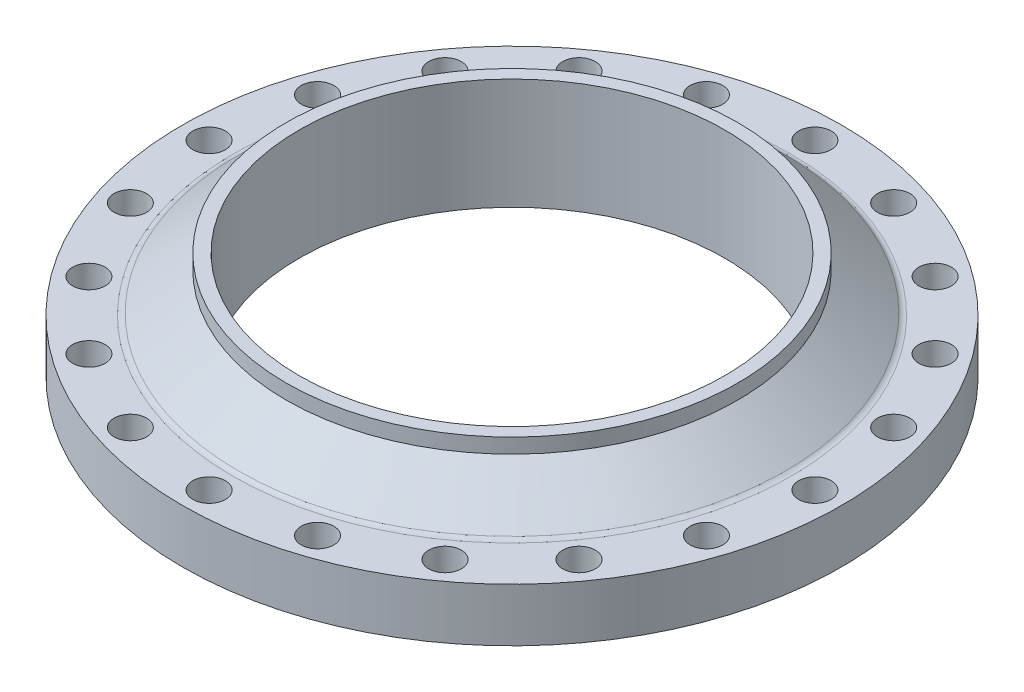
ISO-10303-21;
HEADER;
FILE_DESCRIPTION(('STEP AP214'),'2;1');
FILE_NAME('part.step','',(''),(''),'','','');
FILE_SCHEMA(('AUTOMOTIVE_DESIGN { 1 0 10303 214 1 1 1 1 }'));
ENDSEC;
DATA;
#1=APPLICATION_CONTEXT('core data for automotive mechanical design processes');
#2=APPLICATION_PROTOCOL_DEFINITION('international standard','automotive_design',2000,#1);
#3=PRODUCT_CONTEXT('',#1,'mechanical');
#4=PRODUCT('Part','Part','',(#3));
#5=PRODUCT_RELATED_PRODUCT_CATEGORY('part','',(#4));
#6=PRODUCT_DEFINITION_FORMATION('','',#4);
#7=PRODUCT_DEFINITION_CONTEXT('part definition',#1,'design');
#8=PRODUCT_DEFINITION('design','',#6,#7);
#9=PRODUCT_DEFINITION_SHAPE('','',#8);
#10=(LENGTH_UNIT() NAMED_UNIT(*) SI_UNIT(.MILLI.,.METRE.));
#11=(NAMED_UNIT(*) PLANE_ANGLE_UNIT() SI_UNIT($,.RADIAN.));
#12=(NAMED_UNIT(*) SI_UNIT($,.STERADIAN.) SOLID_ANGLE_UNIT());
#13=UNCERTAINTY_MEASURE_WITH_UNIT(LENGTH_MEASURE(1.E-05),#10,'distance_accuracy_value','');
#14=(GEOMETRIC_REPRESENTATION_CONTEXT(3) GLOBAL_UNCERTAINTY_ASSIGNED_CONTEXT((#13)) GLOBAL_UNIT_ASSIGNED_CONTEXT((#10,
#11,#12)) REPRESENTATION_CONTEXT('',''));
#15=CARTESIAN_POINT('',(0.,0.,0.));
#16=DIRECTION('',(0.,0.,1.));
#17=DIRECTION('',(1.,0.,0.));
#18=AXIS2_PLACEMENT_3D('',#15,#16,#17);
#19=CARTESIAN_POINT('',(287.4,150.,0.));
#20=DIRECTION('',(0.,-1.,0.));
#21=DIRECTION('',(0.,0.,-1.));
#22=AXIS2_PLACEMENT_3D('',#19,#20,#21);
#23=PLANE('',#22);
#24=CARTESIAN_POINT('',(0.,150.,0.));
#25=DIRECTION('',(0.,1.,0.));
#26=DIRECTION('',(0.,0.,1.));
#27=AXIS2_PLACEMENT_3D('',#24,#25,#26);
#28=CIRCLE('',#27,287.4);
#29=CARTESIAN_POINT('',(0.,150.,287.4));
#30=VERTEX_POINT('',#29);
#31=EDGE_CURVE('E10',#30,#30,#28,.T.);
#32=ORIENTED_EDGE('',*,*,#31,.F.);
#33=EDGE_LOOP('',(#32));
#34=FACE_BOUND('',#33,.T.);
#35=CARTESIAN_POINT('',(0.,150.,0.));
#36=DIRECTION('',(0.,1.,0.));
#37=DIRECTION('',(0.,0.,1.));
#38=AXIS2_PLACEMENT_3D('',#35,#36,#37);
#39=CIRCLE('',#38,304.8);
#40=CARTESIAN_POINT('',(0.,150.,304.8));
#41=VERTEX_POINT('',#40);
#42=EDGE_CURVE('E65',#41,#41,#39,.T.);
#43=ORIENTED_EDGE('',*,*,#42,.T.);
#44=EDGE_LOOP('',(#43));
#45=FACE_BOUND('',#44,.T.);
#46=ADVANCED_FACE('F31',(#34,#45),#23,.F.);
#47=CARTESIAN_POINT('',(0.,163.859738805859,0.));
#48=DIRECTION('',(0.,1.,0.));
#49=DIRECTION('',(0.,0.,1.));
#50=AXIS2_PLACEMENT_3D('',#47,#48,#49);
#51=CYLINDRICAL_SURFACE('',#50,287.4);
#52=CARTESIAN_POINT('',(0.,0.,0.));
#53=DIRECTION('',(0.,1.,0.));
#54=DIRECTION('',(0.,0.,1.));
#55=AXIS2_PLACEMENT_3D('',#52,#53,#54);
#56=CIRCLE('',#55,287.4);
#57=CARTESIAN_POINT('',(0.,0.,287.4));
#58=VERTEX_POINT('',#57);
#59=EDGE_CURVE('E37',#58,#58,#56,.T.);
#60=ORIENTED_EDGE('',*,*,#59,.F.);
#61=EDGE_LOOP('',(#60));
#62=FACE_BOUND('',#61,.T.);
#63=ORIENTED_EDGE('',*,*,#31,.T.);
#64=EDGE_LOOP('',(#63));
#65=FACE_BOUND('',#64,.T.);
#66=ADVANCED_FACE('F216',(#62,#65),#51,.F.);
#67=CARTESIAN_POINT('',(370.,0.,0.));
#68=DIRECTION('',(0.,1.,0.));
#69=DIRECTION('',(0.,0.,1.));
#70=AXIS2_PLACEMENT_3D('',#67,#68,#69);
#71=PLANE('',#70);
#72=CARTESIAN_POINT('',(0.,0.,0.));
#73=DIRECTION('',(0.,1.,0.));
#74=DIRECTION('',(0.,0.,1.));
#75=AXIS2_PLACEMENT_3D('',#72,#73,#74);
#76=CIRCLE('',#75,370.);
#77=CARTESIAN_POINT('',(0.,0.,370.));
#78=VERTEX_POINT('',#77);
#79=EDGE_CURVE('E41',#78,#78,#76,.T.);
#80=ORIENTED_EDGE('',*,*,#79,.F.);
#81=EDGE_LOOP('',(#80));
#82=FACE_BOUND('',#81,.T.);
#83=ORIENTED_EDGE('',*,*,#59,.T.);
#84=EDGE_LOOP('',(#83));
#85=FACE_BOUND('',#84,.T.);
#86=ADVANCED_FACE('F211',(#82,#85),#71,.F.);
#87=CARTESIAN_POINT('',(0.,0.,0.));
#88=DIRECTION('',(0.,1.,0.));
#89=DIRECTION('',(0.,0.,1.));
#90=AXIS2_PLACEMENT_3D('',#87,#88,#89);
#91=CONICAL_SURFACE('',#90,370.,0.785398163397448);
#92=CARTESIAN_POINT('',(0.,5.,0.));
#93=DIRECTION('',(0.,1.,0.));
#94=DIRECTION('',(0.,0.,1.));
#95=AXIS2_PLACEMENT_3D('',#92,#93,#94);
#96=CIRCLE('',#95,375.);
#97=CARTESIAN_POINT('',(0.,5.,375.));
#98=VERTEX_POINT('',#97);
#99=EDGE_CURVE('E45',#98,#98,#96,.T.);
#100=ORIENTED_EDGE('',*,*,#99,.F.);
#101=EDGE_LOOP('',(#100));
#102=FACE_BOUND('',#101,.T.);
#103=ORIENTED_EDGE('',*,*,#79,.T.);
#104=EDGE_LOOP('',(#103));
#105=FACE_BOUND('',#104,.T.);
#106=ADVANCED_FACE('F196',(#102,#105),#91,.T.);
#107=CARTESIAN_POINT('',(445.,5.00000000000002,0.));
#108=DIRECTION('',(0.,1.,0.));
#109=DIRECTION('',(0.,0.,1.));
#110=AXIS2_PLACEMENT_3D('',#107,#108,#109);
#111=PLANE('',#110);
#112=CARTESIAN_POINT('',(-388.982115164706,5.00000000000002,126.387950699337));
#113=DIRECTION('',(0.,-1.,0.));
#114=DIRECTION('',(0.,0.,-1.));
#115=AXIS2_PLACEMENT_3D('',#112,#113,#114);
#116=CIRCLE('',#115,22.0000000000208);
#117=CARTESIAN_POINT('',(-388.982115164706,5.00000000000002,104.387950699316));
#118=VERTEX_POINT('',#117);
#119=EDGE_CURVE('E127',#118,#118,#116,.T.);
#120=ORIENTED_EDGE('',*,*,#119,.F.);
#121=EDGE_LOOP('',(#120));
#122=FACE_BOUND('',#121,.T.);
#123=CARTESIAN_POINT('',(-408.999999999983,5.00000000000002,-1.74116747085103E-11));
#124=DIRECTION('',(0.,-1.,0.));
#125=DIRECTION('',(0.,0.,-1.));
#126=AXIS2_PLACEMENT_3D('',#123,#124,#125);
#127=CIRCLE('',#126,22.0000000000258);
#128=CARTESIAN_POINT('',(-408.999999999983,5.00000000000002,-22.0000000000432));
#129=VERTEX_POINT('',#128);
#130=EDGE_CURVE('E126',#129,#129,#127,.T.);
#131=ORIENTED_EDGE('',*,*,#130,.F.);
#132=EDGE_LOOP('',(#131));
#133=FACE_BOUND('',#132,.T.);
#134=CARTESIAN_POINT('',(-388.982115164695,5.00000000000002,-126.38795069937));
#135=DIRECTION('',(0.,-1.,0.));
#136=DIRECTION('',(0.,0.,-1.));
#137=AXIS2_PLACEMENT_3D('',#134,#135,#136);
#138=CIRCLE('',#137,22.0000000000304);
#139=CARTESIAN_POINT('',(-388.982115164695,5.00000000000002,-148.3879506994));
#140=VERTEX_POINT('',#139);
#141=EDGE_CURVE('E134',#140,#140,#138,.T.);
#142=ORIENTED_EDGE('',*,*,#141,.F.);
#143=EDGE_LOOP('',(#142));
#144=FACE_BOUND('',#143,.T.);
#145=CARTESIAN_POINT('',(-330.887950699326,5.00000000000002,-240.404168187636));
#146=DIRECTION('',(0.,-1.,0.));
#147=DIRECTION('',(0.,0.,-1.));
#148=AXIS2_PLACEMENT_3D('',#145,#146,#147);
#149=CIRCLE('',#148,22.0000000000343);
#150=CARTESIAN_POINT('',(-330.887950699326,5.00000000000002,-262.40416818767));
#151=VERTEX_POINT('',#150);
#152=EDGE_CURVE('E140',#151,#151,#149,.T.);
#153=ORIENTED_EDGE('',*,*,#152,.F.);
#154=EDGE_LOOP('',(#153));
#155=FACE_BOUND('',#154,.T.);
#156=CARTESIAN_POINT('',(-240.40416818759,5.00000000000002,-330.887950699364));
#157=DIRECTION('',(0.,-1.,0.));
#158=DIRECTION('',(0.,0.,-1.));
#159=AXIS2_PLACEMENT_3D('',#156,#157,#158);
#160=CIRCLE('',#159,22.0000000000364);
#161=CARTESIAN_POINT('',(-240.40416818759,5.00000000000002,-352.8879506994));
#162=VERTEX_POINT('',#161);
#163=EDGE_CURVE('E146',#162,#162,#160,.T.);
#164=ORIENTED_EDGE('',*,*,#163,.F.);
#165=EDGE_LOOP('',(#164));
#166=FACE_BOUND('',#165,.T.);
#167=CARTESIAN_POINT('',(-126.38795069932,5.00000000000002,-388.982115164723));
#168=DIRECTION('',(0.,-1.,0.));
#169=DIRECTION('',(0.,0.,-1.));
#170=AXIS2_PLACEMENT_3D('',#167,#168,#169);
#171=CIRCLE('',#170,22.000000000037);
#172=CARTESIAN_POINT('',(-126.38795069932,5.00000000000002,-410.98211516476));
#173=VERTEX_POINT('',#172);
#174=EDGE_CURVE('E152',#173,#173,#171,.T.);
#175=ORIENTED_EDGE('',*,*,#174,.F.);
#176=EDGE_LOOP('',(#175));
#177=FACE_BOUND('',#176,.T.);
#178=CARTESIAN_POINT('',(3.47231733088503E-11,5.00000000000002,-409.));
#179=DIRECTION('',(0.,-1.,0.));
#180=DIRECTION('',(0.,0.,-1.));
#181=AXIS2_PLACEMENT_3D('',#178,#179,#180);
#182=CIRCLE('',#181,22.0000000000359);
#183=CARTESIAN_POINT('',(3.47231733088503E-11,5.00000000000002,-431.000000000036));
#184=VERTEX_POINT('',#183);
#185=EDGE_CURVE('E158',#184,#184,#182,.T.);
#186=ORIENTED_EDGE('',*,*,#185,.F.);
#187=EDGE_LOOP('',(#186));
#188=FACE_BOUND('',#187,.T.);
#189=CARTESIAN_POINT('',(126.387950699387,5.00000000000002,-388.982115164712));
#190=DIRECTION('',(0.,-1.,0.));
#191=DIRECTION('',(0.,0.,-1.));
#192=AXIS2_PLACEMENT_3D('',#189,#190,#191);
#193=CIRCLE('',#192,22.0000000000334);
#194=CARTESIAN_POINT('',(126.387950699387,5.00000000000002,-410.982115164746));
#195=VERTEX_POINT('',#194);
#196=EDGE_CURVE('E164',#195,#195,#193,.T.);
#197=ORIENTED_EDGE('',*,*,#196,.F.);
#198=EDGE_LOOP('',(#197));
#199=FACE_BOUND('',#198,.T.);
#200=CARTESIAN_POINT('',(240.404168187653,5.00000000000002,-330.887950699343));
#201=DIRECTION('',(0.,-1.,0.));
#202=DIRECTION('',(0.,0.,-1.));
#203=AXIS2_PLACEMENT_3D('',#200,#201,#202);
#204=CIRCLE('',#203,22.0000000000293);
#205=CARTESIAN_POINT('',(240.404168187653,5.00000000000002,-352.887950699373));
#206=VERTEX_POINT('',#205);
#207=EDGE_CURVE('E79',#206,#206,#204,.T.);
#208=ORIENTED_EDGE('',*,*,#207,.F.);
#209=EDGE_LOOP('',(#208));
#210=FACE_BOUND('',#209,.T.);
#211=CARTESIAN_POINT('',(330.887950699381,5.00000000000002,-240.404168187607));
#212=DIRECTION('',(0.,-1.,0.));
#213=DIRECTION('',(0.,0.,-1.));
#214=AXIS2_PLACEMENT_3D('',#211,#212,#213);
#215=CIRCLE('',#214,22.0000000000241);
#216=CARTESIAN_POINT('',(330.887950699381,5.00000000000002,-262.404168187632));
#217=VERTEX_POINT('',#216);
#218=EDGE_CURVE('E78',#217,#217,#215,.T.);
#219=ORIENTED_EDGE('',*,*,#218,.F.);
#220=EDGE_LOOP('',(#219));
#221=FACE_BOUND('',#220,.T.);
#222=CARTESIAN_POINT('',(388.98211516474,5.00000000000002,-126.387950699337));
#223=DIRECTION('',(0.,-1.,0.));
#224=DIRECTION('',(0.,0.,-1.));
#225=AXIS2_PLACEMENT_3D('',#222,#223,#224);
#226=CIRCLE('',#225,22.0000000000186);
#227=CARTESIAN_POINT('',(388.98211516474,5.00000000000002,-148.387950699356));
#228=VERTEX_POINT('',#227);
#229=EDGE_CURVE('E86',#228,#228,#226,.T.);
#230=ORIENTED_EDGE('',*,*,#229,.F.);
#231=EDGE_LOOP('',(#230));
#232=FACE_BOUND('',#231,.T.);
#233=CARTESIAN_POINT('',(409.000000000017,5.00000000000002,1.73615866544252E-11));
#234=DIRECTION('',(0.,-1.,0.));
#235=DIRECTION('',(0.,0.,-1.));
#236=AXIS2_PLACEMENT_3D('',#233,#234,#235);
#237=CIRCLE('',#236,22.0000000000129);
#238=CARTESIAN_POINT('',(409.000000000017,5.00000000000002,-21.9999999999955));
#239=VERTEX_POINT('',#238);
#240=EDGE_CURVE('E92',#239,#239,#237,.T.);
#241=ORIENTED_EDGE('',*,*,#240,.F.);
#242=EDGE_LOOP('',(#241));
#243=FACE_BOUND('',#242,.T.);
#244=CARTESIAN_POINT('',(388.98211516473,5.00000000000002,126.38795069937));
#245=DIRECTION('',(0.,-1.,0.));
#246=DIRECTION('',(0.,0.,-1.));
#247=AXIS2_PLACEMENT_3D('',#244,#245,#246);
#248=CIRCLE('',#247,22.0000000000078);
#249=CARTESIAN_POINT('',(388.98211516473,5.00000000000002,104.387950699362));
#250=VERTEX_POINT('',#249);
#251=EDGE_CURVE('E98',#250,#250,#248,.T.);
#252=ORIENTED_EDGE('',*,*,#251,.F.);
#253=EDGE_LOOP('',(#252));
#254=FACE_BOUND('',#253,.T.);
#255=CARTESIAN_POINT('',(330.887950699361,5.00000000000002,240.404168187636));
#256=DIRECTION('',(0.,-1.,0.));
#257=DIRECTION('',(0.,0.,-1.));
#258=AXIS2_PLACEMENT_3D('',#255,#256,#257);
#259=CIRCLE('',#258,22.0000000000035);
#260=CARTESIAN_POINT('',(330.887950699361,5.00000000000002,218.404168187632));
#261=VERTEX_POINT('',#260);
#262=EDGE_CURVE('E104',#261,#261,#259,.T.);
#263=ORIENTED_EDGE('',*,*,#262,.F.);
#264=EDGE_LOOP('',(#263));
#265=FACE_BOUND('',#264,.T.);
#266=CARTESIAN_POINT('',(240.404168187625,5.00000000000002,330.887950699364));
#267=DIRECTION('',(0.,-1.,0.));
#268=DIRECTION('',(0.,0.,-1.));
#269=AXIS2_PLACEMENT_3D('',#266,#267,#268);
#270=CIRCLE('',#269,22.0000000000008);
#271=CARTESIAN_POINT('',(240.404168187625,5.00000000000002,308.887950699363));
#272=VERTEX_POINT('',#271);
#273=EDGE_CURVE('E110',#272,#272,#270,.T.);
#274=ORIENTED_EDGE('',*,*,#273,.F.);
#275=EDGE_LOOP('',(#274));
#276=FACE_BOUND('',#275,.T.);
#277=CARTESIAN_POINT('',(126.387950699354,5.00000000000002,388.982115164718));
#278=DIRECTION('',(0.,-1.,0.));
#279=DIRECTION('',(0.,0.,-1.));
#280=AXIS2_PLACEMENT_3D('',#277,#278,#279);
#281=CIRCLE('',#280,22.);
#282=CARTESIAN_POINT('',(126.387950699354,5.00000000000002,366.982115164718));
#283=VERTEX_POINT('',#282);
#284=EDGE_CURVE('E116',#283,#283,#281,.T.);
#285=ORIENTED_EDGE('',*,*,#284,.F.);
#286=EDGE_LOOP('',(#285));
#287=FACE_BOUND('',#286,.T.);
#288=CARTESIAN_POINT('',(-330.887950699346,5.00000000000002,240.404168187607));
#289=DIRECTION('',(0.,-1.,0.));
#290=DIRECTION('',(0.,0.,-1.));
#291=AXIS2_PLACEMENT_3D('',#288,#289,#290);
#292=CIRCLE('',#291,22.0000000000158);
#293=CARTESIAN_POINT('',(-330.887950699346,5.00000000000002,218.404168187592));
#294=VERTEX_POINT('',#293);
#295=EDGE_CURVE('E181',#294,#294,#292,.T.);
#296=ORIENTED_EDGE('',*,*,#295,.F.);
#297=EDGE_LOOP('',(#296));
#298=FACE_BOUND('',#297,.T.);
#299=CARTESIAN_POINT('',(-240.404168187618,5.00000000000002,330.887950699343));
#300=DIRECTION('',(0.,-1.,0.));
#301=DIRECTION('',(0.,0.,-1.));
#302=AXIS2_PLACEMENT_3D('',#299,#300,#301);
#303=CIRCLE('',#302,22.0000000000113);
#304=CARTESIAN_POINT('',(-240.404168187618,5.00000000000002,308.887950699332));
#305=VERTEX_POINT('',#304);
#306=EDGE_CURVE('E174',#305,#305,#303,.T.);
#307=ORIENTED_EDGE('',*,*,#306,.F.);
#308=EDGE_LOOP('',(#307));
#309=FACE_BOUND('',#308,.T.);
#310=CARTESIAN_POINT('',(-126.387950699348,5.00000000000002,388.982115164719));
#311=DIRECTION('',(0.,-1.,0.));
#312=DIRECTION('',(0.,0.,-1.));
#313=AXIS2_PLACEMENT_3D('',#310,#311,#312);
#314=CIRCLE('',#313,22.);
#315=CARTESIAN_POINT('',(-126.387950699348,5.00000000000002,366.982115164719));
#316=VERTEX_POINT('',#315);
#317=EDGE_CURVE('E175',#316,#316,#314,.T.);
#318=ORIENTED_EDGE('',*,*,#317,.F.);
#319=EDGE_LOOP('',(#318));
#320=FACE_BOUND('',#319,.T.);
#321=CARTESIAN_POINT('',(0.,5.00000000000002,409.));
#322=DIRECTION('',(0.,-1.,0.));
#323=DIRECTION('',(0.,0.,-1.));
#324=AXIS2_PLACEMENT_3D('',#321,#322,#323);
#325=CIRCLE('',#324,22.);
#326=CARTESIAN_POINT('',(0.,5.00000000000002,387.));
#327=VERTEX_POINT('',#326);
#328=EDGE_CURVE('E71',#327,#327,#325,.T.);
#329=ORIENTED_EDGE('',*,*,#328,.F.);
#330=EDGE_LOOP('',(#329));
#331=FACE_BOUND('',#330,.T.);
#332=CARTESIAN_POINT('',(0.,5.00000000000003,0.));
#333=DIRECTION('',(0.,1.,0.));
#334=DIRECTION('',(0.,0.,1.));
#335=AXIS2_PLACEMENT_3D('',#332,#333,#334);
#336=CIRCLE('',#335,445.);
#337=CARTESIAN_POINT('',(0.,5.00000000000003,445.));
#338=VERTEX_POINT('',#337);
#339=EDGE_CURVE('E50',#338,#338,#336,.T.);
#340=ORIENTED_EDGE('',*,*,#339,.F.);
#341=EDGE_LOOP('',(#340));
#342=FACE_BOUND('',#341,.T.);
#343=ORIENTED_EDGE('',*,*,#99,.T.);
#344=EDGE_LOOP('',(#343));
#345=FACE_BOUND('',#344,.T.);
#346=ADVANCED_FACE('F192',(#122,#133,#144,#155,#166,#177,#188,#199,#210,#221,#232,#243,#254,
#265,#276,#287,#298,#309,#320,#331,#342,#345),#111,.F.);
#347=CARTESIAN_POINT('',(0.,163.859738805859,0.));
#348=DIRECTION('',(0.,1.,0.));
#349=DIRECTION('',(0.,0.,1.));
#350=AXIS2_PLACEMENT_3D('',#347,#348,#349);
#351=CYLINDRICAL_SURFACE('',#350,445.);
#352=CARTESIAN_POINT('',(0.,77.,0.));
#353=DIRECTION('',(0.,1.,0.));
#354=DIRECTION('',(0.,0.,1.));
#355=AXIS2_PLACEMENT_3D('',#352,#353,#354);
#356=CIRCLE('',#355,445.);
#357=CARTESIAN_POINT('',(0.,77.,445.));
#358=VERTEX_POINT('',#357);
#359=EDGE_CURVE('E53',#358,#358,#356,.T.);
#360=ORIENTED_EDGE('',*,*,#359,.F.);
#361=EDGE_LOOP('',(#360));
#362=FACE_BOUND('',#361,.T.);
#363=ORIENTED_EDGE('',*,*,#339,.T.);
#364=EDGE_LOOP('',(#363));
#365=FACE_BOUND('',#364,.T.);
#366=ADVANCED_FACE('F195',(#362,#365),#351,.T.);
#367=CARTESIAN_POINT('',(376.76883786571,77.,0.));
#368=DIRECTION('',(0.,-1.,0.));
#369=DIRECTION('',(0.,0.,-1.));
#370=AXIS2_PLACEMENT_3D('',#367,#368,#369);
#371=PLANE('',#370);
#372=CARTESIAN_POINT('',(-388.982115164706,77.,126.387950699337));
#373=DIRECTION('',(0.,-1.,0.));
#374=DIRECTION('',(0.,0.,-1.));
#375=AXIS2_PLACEMENT_3D('',#372,#373,#374);
#376=CIRCLE('',#375,22.0000000000208);
#377=CARTESIAN_POINT('',(-388.982115164706,77.,104.387950699316));
#378=VERTEX_POINT('',#377);
#379=EDGE_CURVE('E123',#378,#378,#376,.F.);
#380=ORIENTED_EDGE('',*,*,#379,.F.);
#381=EDGE_LOOP('',(#380));
#382=FACE_BOUND('',#381,.T.);
#383=CARTESIAN_POINT('',(-408.999999999983,77.,-1.74116747085103E-11));
#384=DIRECTION('',(0.,-1.,0.));
#385=DIRECTION('',(0.,0.,-1.));
#386=AXIS2_PLACEMENT_3D('',#383,#384,#385);
#387=CIRCLE('',#386,22.0000000000258);
#388=CARTESIAN_POINT('',(-408.999999999983,77.,-22.0000000000432));
#389=VERTEX_POINT('',#388);
#390=EDGE_CURVE('E131',#389,#389,#387,.F.);
#391=ORIENTED_EDGE('',*,*,#390,.F.);
#392=EDGE_LOOP('',(#391));
#393=FACE_BOUND('',#392,.T.);
#394=CARTESIAN_POINT('',(-388.982115164695,77.,-126.38795069937));
#395=DIRECTION('',(0.,-1.,0.));
#396=DIRECTION('',(0.,0.,-1.));
#397=AXIS2_PLACEMENT_3D('',#394,#395,#396);
#398=CIRCLE('',#397,22.0000000000304);
#399=CARTESIAN_POINT('',(-388.982115164695,77.,-148.3879506994));
#400=VERTEX_POINT('',#399);
#401=EDGE_CURVE('E137',#400,#400,#398,.F.);
#402=ORIENTED_EDGE('',*,*,#401,.F.);
#403=EDGE_LOOP('',(#402));
#404=FACE_BOUND('',#403,.T.);
#405=CARTESIAN_POINT('',(-330.887950699326,77.,-240.404168187636));
#406=DIRECTION('',(0.,-1.,0.));
#407=DIRECTION('',(0.,0.,-1.));
#408=AXIS2_PLACEMENT_3D('',#405,#406,#407);
#409=CIRCLE('',#408,22.0000000000343);
#410=CARTESIAN_POINT('',(-330.887950699326,77.,-262.40416818767));
#411=VERTEX_POINT('',#410);
#412=EDGE_CURVE('E143',#411,#411,#409,.F.);
#413=ORIENTED_EDGE('',*,*,#412,.F.);
#414=EDGE_LOOP('',(#413));
#415=FACE_BOUND('',#414,.T.);
#416=CARTESIAN_POINT('',(-240.40416818759,77.,-330.887950699364));
#417=DIRECTION('',(0.,-1.,0.));
#418=DIRECTION('',(0.,0.,-1.));
#419=AXIS2_PLACEMENT_3D('',#416,#417,#418);
#420=CIRCLE('',#419,22.0000000000364);
#421=CARTESIAN_POINT('',(-240.40416818759,77.,-352.8879506994));
#422=VERTEX_POINT('',#421);
#423=EDGE_CURVE('E149',#422,#422,#420,.F.);
#424=ORIENTED_EDGE('',*,*,#423,.F.);
#425=EDGE_LOOP('',(#424));
#426=FACE_BOUND('',#425,.T.);
#427=CARTESIAN_POINT('',(-126.38795069932,77.,-388.982115164723));
#428=DIRECTION('',(0.,-1.,0.));
#429=DIRECTION('',(0.,0.,-1.));
#430=AXIS2_PLACEMENT_3D('',#427,#428,#429);
#431=CIRCLE('',#430,22.000000000037);
#432=CARTESIAN_POINT('',(-126.38795069932,77.,-410.98211516476));
#433=VERTEX_POINT('',#432);
#434=EDGE_CURVE('E155',#433,#433,#431,.F.);
#435=ORIENTED_EDGE('',*,*,#434,.F.);
#436=EDGE_LOOP('',(#435));
#437=FACE_BOUND('',#436,.T.);
#438=CARTESIAN_POINT('',(3.47231733088503E-11,77.,-409.));
#439=DIRECTION('',(0.,-1.,0.));
#440=DIRECTION('',(0.,0.,-1.));
#441=AXIS2_PLACEMENT_3D('',#438,#439,#440);
#442=CIRCLE('',#441,22.0000000000359);
#443=CARTESIAN_POINT('',(3.47231733088503E-11,77.,-431.000000000036));
#444=VERTEX_POINT('',#443);
#445=EDGE_CURVE('E161',#444,#444,#442,.F.);
#446=ORIENTED_EDGE('',*,*,#445,.F.);
#447=EDGE_LOOP('',(#446));
#448=FACE_BOUND('',#447,.T.);
#449=CARTESIAN_POINT('',(126.387950699387,77.,-388.982115164712));
#450=DIRECTION('',(0.,-1.,0.));
#451=DIRECTION('',(0.,0.,-1.));
#452=AXIS2_PLACEMENT_3D('',#449,#450,#451);
#453=CIRCLE('',#452,22.0000000000334);
#454=CARTESIAN_POINT('',(126.387950699387,77.,-410.982115164746));
#455=VERTEX_POINT('',#454);
#456=EDGE_CURVE('E82',#455,#455,#453,.F.);
#457=ORIENTED_EDGE('',*,*,#456,.F.);
#458=EDGE_LOOP('',(#457));
#459=FACE_BOUND('',#458,.T.);
#460=CARTESIAN_POINT('',(240.404168187653,77.,-330.887950699343));
#461=DIRECTION('',(0.,-1.,0.));
#462=DIRECTION('',(0.,0.,-1.));
#463=AXIS2_PLACEMENT_3D('',#460,#461,#462);
#464=CIRCLE('',#463,22.0000000000293);
#465=CARTESIAN_POINT('',(240.404168187653,77.,-352.887950699373));
#466=VERTEX_POINT('',#465);
#467=EDGE_CURVE('E75',#466,#466,#464,.F.);
#468=ORIENTED_EDGE('',*,*,#467,.F.);
#469=EDGE_LOOP('',(#468));
#470=FACE_BOUND('',#469,.T.);
#471=CARTESIAN_POINT('',(330.887950699381,77.,-240.404168187607));
#472=DIRECTION('',(0.,-1.,0.));
#473=DIRECTION('',(0.,0.,-1.));
#474=AXIS2_PLACEMENT_3D('',#471,#472,#473);
#475=CIRCLE('',#474,22.0000000000241);
#476=CARTESIAN_POINT('',(330.887950699381,77.,-262.404168187632));
#477=VERTEX_POINT('',#476);
#478=EDGE_CURVE('E83',#477,#477,#475,.F.);
#479=ORIENTED_EDGE('',*,*,#478,.F.);
#480=EDGE_LOOP('',(#479));
#481=FACE_BOUND('',#480,.T.);
#482=CARTESIAN_POINT('',(388.98211516474,77.,-126.387950699337));
#483=DIRECTION('',(0.,-1.,0.));
#484=DIRECTION('',(0.,0.,-1.));
#485=AXIS2_PLACEMENT_3D('',#482,#483,#484);
#486=CIRCLE('',#485,22.0000000000186);
#487=CARTESIAN_POINT('',(388.98211516474,77.,-148.387950699356));
#488=VERTEX_POINT('',#487);
#489=EDGE_CURVE('E89',#488,#488,#486,.F.);
#490=ORIENTED_EDGE('',*,*,#489,.F.);
#491=EDGE_LOOP('',(#490));
#492=FACE_BOUND('',#491,.T.);
#493=CARTESIAN_POINT('',(409.000000000017,77.,1.73615866544252E-11));
#494=DIRECTION('',(0.,-1.,0.));
#495=DIRECTION('',(0.,0.,-1.));
#496=AXIS2_PLACEMENT_3D('',#493,#494,#495);
#497=CIRCLE('',#496,22.0000000000129);
#498=CARTESIAN_POINT('',(409.000000000017,77.,-21.9999999999955));
#499=VERTEX_POINT('',#498);
#500=EDGE_CURVE('E95',#499,#499,#497,.F.);
#501=ORIENTED_EDGE('',*,*,#500,.F.);
#502=EDGE_LOOP('',(#501));
#503=FACE_BOUND('',#502,.T.);
#504=CARTESIAN_POINT('',(388.98211516473,77.,126.38795069937));
#505=DIRECTION('',(0.,-1.,0.));
#506=DIRECTION('',(0.,0.,-1.));
#507=AXIS2_PLACEMENT_3D('',#504,#505,#506);
#508=CIRCLE('',#507,22.0000000000078);
#509=CARTESIAN_POINT('',(388.98211516473,77.,104.387950699362));
#510=VERTEX_POINT('',#509);
#511=EDGE_CURVE('E101',#510,#510,#508,.F.);
#512=ORIENTED_EDGE('',*,*,#511,.F.);
#513=EDGE_LOOP('',(#512));
#514=FACE_BOUND('',#513,.T.);
#515=CARTESIAN_POINT('',(330.887950699361,77.,240.404168187636));
#516=DIRECTION('',(0.,-1.,0.));
#517=DIRECTION('',(0.,0.,-1.));
#518=AXIS2_PLACEMENT_3D('',#515,#516,#517);
#519=CIRCLE('',#518,22.0000000000035);
#520=CARTESIAN_POINT('',(330.887950699361,77.,218.404168187632));
#521=VERTEX_POINT('',#520);
#522=EDGE_CURVE('E107',#521,#521,#519,.F.);
#523=ORIENTED_EDGE('',*,*,#522,.F.);
#524=EDGE_LOOP('',(#523));
#525=FACE_BOUND('',#524,.T.);
#526=CARTESIAN_POINT('',(240.404168187625,77.,330.887950699364));
#527=DIRECTION('',(0.,-1.,0.));
#528=DIRECTION('',(0.,0.,-1.));
#529=AXIS2_PLACEMENT_3D('',#526,#527,#528);
#530=CIRCLE('',#529,22.0000000000008);
#531=CARTESIAN_POINT('',(240.404168187625,77.,308.887950699363));
#532=VERTEX_POINT('',#531);
#533=EDGE_CURVE('E113',#532,#532,#530,.F.);
#534=ORIENTED_EDGE('',*,*,#533,.F.);
#535=EDGE_LOOP('',(#534));
#536=FACE_BOUND('',#535,.T.);
#537=CARTESIAN_POINT('',(126.387950699354,77.,388.982115164718));
#538=DIRECTION('',(0.,-1.,0.));
#539=DIRECTION('',(0.,0.,-1.));
#540=AXIS2_PLACEMENT_3D('',#537,#538,#539);
#541=CIRCLE('',#540,22.);
#542=CARTESIAN_POINT('',(126.387950699354,77.,366.982115164718));
#543=VERTEX_POINT('',#542);
#544=EDGE_CURVE('E74',#543,#543,#541,.F.);
#545=ORIENTED_EDGE('',*,*,#544,.F.);
#546=EDGE_LOOP('',(#545));
#547=FACE_BOUND('',#546,.T.);
#548=CARTESIAN_POINT('',(-330.887950699346,77.,240.404168187607));
#549=DIRECTION('',(0.,-1.,0.));
#550=DIRECTION('',(0.,0.,-1.));
#551=AXIS2_PLACEMENT_3D('',#548,#549,#550);
#552=CIRCLE('',#551,22.0000000000158);
#553=CARTESIAN_POINT('',(-330.887950699346,77.,218.404168187592));
#554=VERTEX_POINT('',#553);
#555=EDGE_CURVE('E130',#554,#554,#552,.F.);
#556=ORIENTED_EDGE('',*,*,#555,.F.);
#557=EDGE_LOOP('',(#556));
#558=FACE_BOUND('',#557,.T.);
#559=CARTESIAN_POINT('',(-240.404168187618,77.,330.887950699343));
#560=DIRECTION('',(0.,-1.,0.));
#561=DIRECTION('',(0.,0.,-1.));
#562=AXIS2_PLACEMENT_3D('',#559,#560,#561);
#563=CIRCLE('',#562,22.0000000000113);
#564=CARTESIAN_POINT('',(-240.404168187618,77.,308.887950699332));
#565=VERTEX_POINT('',#564);
#566=EDGE_CURVE('E178',#565,#565,#563,.F.);
#567=ORIENTED_EDGE('',*,*,#566,.F.);
#568=EDGE_LOOP('',(#567));
#569=FACE_BOUND('',#568,.T.);
#570=CARTESIAN_POINT('',(-126.387950699348,77.,388.982115164719));
#571=DIRECTION('',(0.,-1.,0.));
#572=DIRECTION('',(0.,0.,-1.));
#573=AXIS2_PLACEMENT_3D('',#570,#571,#572);
#574=CIRCLE('',#573,22.);
#575=CARTESIAN_POINT('',(-126.387950699348,77.,366.982115164719));
#576=VERTEX_POINT('',#575);
#577=EDGE_CURVE('E171',#576,#576,#574,.F.);
#578=ORIENTED_EDGE('',*,*,#577,.F.);
#579=EDGE_LOOP('',(#578));
#580=FACE_BOUND('',#579,.T.);
#581=CARTESIAN_POINT('',(0.,77.,409.));
#582=DIRECTION('',(0.,-1.,0.));
#583=DIRECTION('',(0.,0.,-1.));
#584=AXIS2_PLACEMENT_3D('',#581,#582,#583);
#585=CIRCLE('',#584,22.);
#586=CARTESIAN_POINT('',(0.,77.,387.));
#587=VERTEX_POINT('',#586);
#588=EDGE_CURVE('E68',#587,#587,#585,.F.);
#589=ORIENTED_EDGE('',*,*,#588,.F.);
#590=EDGE_LOOP('',(#589));
#591=FACE_BOUND('',#590,.T.);
#592=CARTESIAN_POINT('',(0.,77.,0.));
#593=DIRECTION('',(0.,1.,0.));
#594=DIRECTION('',(0.,0.,1.));
#595=AXIS2_PLACEMENT_3D('',#592,#593,#594);
#596=CIRCLE('',#595,376.76883786571);
#597=CARTESIAN_POINT('',(0.,77.,376.76883786571));
#598=VERTEX_POINT('',#597);
#599=EDGE_CURVE('E56',#598,#598,#596,.T.);
#600=ORIENTED_EDGE('',*,*,#599,.F.);
#601=EDGE_LOOP('',(#600));
#602=FACE_BOUND('',#601,.T.);
#603=ORIENTED_EDGE('',*,*,#359,.T.);
#604=EDGE_LOOP('',(#603));
#605=FACE_BOUND('',#604,.T.);
#606=ADVANCED_FACE('F245',(#382,#393,#404,#415,#426,#437,#448,#459,#470,#481,#492,#503,#514,
#525,#536,#547,#558,#569,#580,#591,#602,#605),#371,.F.);
#607=CARTESIAN_POINT('',(0.,89.,0.));
#608=DIRECTION('',(0.,1.,0.));
#609=DIRECTION('',(0.,0.,1.));
#610=AXIS2_PLACEMENT_3D('',#607,#608,#609);
#611=TOROIDAL_SURFACE('',#610,376.768837865709,12.);
#612=CARTESIAN_POINT('',(0.,79.5438709567194,0.));
#613=DIRECTION('',(0.,1.,0.));
#614=DIRECTION('',(0.,0.,1.));
#615=AXIS2_PLACEMENT_3D('',#612,#613,#614);
#616=CIRCLE('',#615,369.380900161802);
#617=CARTESIAN_POINT('',(0.,79.5438709567194,369.380900161802));
#618=VERTEX_POINT('',#617);
#619=EDGE_CURVE('E59',#618,#618,#616,.T.);
#620=ORIENTED_EDGE('',*,*,#619,.F.);
#621=EDGE_LOOP('',(#620));
#622=FACE_BOUND('',#621,.T.);
#623=ORIENTED_EDGE('',*,*,#599,.T.);
#624=EDGE_LOOP('',(#623));
#625=FACE_BOUND('',#624,.T.);
#626=ADVANCED_FACE('F239',(#622,#625),#611,.F.);
#627=CARTESIAN_POINT('',(0.,79.5438709567194,0.));
#628=DIRECTION('',(0.,-1.,0.));
#629=DIRECTION('',(0.,0.,-1.));
#630=AXIS2_PLACEMENT_3D('',#627,#628,#629);
#631=CONICAL_SURFACE('',#630,369.380900161802,0.907571211037054);
#632=CARTESIAN_POINT('',(0.,130.,0.));
#633=DIRECTION('',(0.,1.,0.));
#634=DIRECTION('',(0.,0.,1.));
#635=AXIS2_PLACEMENT_3D('',#632,#633,#634);
#636=CIRCLE('',#635,304.8);
#637=CARTESIAN_POINT('',(0.,130.,304.8));
#638=VERTEX_POINT('',#637);
#639=EDGE_CURVE('E62',#638,#638,#636,.T.);
#640=ORIENTED_EDGE('',*,*,#639,.F.);
#641=EDGE_LOOP('',(#640));
#642=FACE_BOUND('',#641,.T.);
#643=ORIENTED_EDGE('',*,*,#619,.T.);
#644=EDGE_LOOP('',(#643));
#645=FACE_BOUND('',#644,.T.);
#646=ADVANCED_FACE('F233',(#642,#645),#631,.T.);
#647=CARTESIAN_POINT('',(0.,163.859738805859,0.));
#648=DIRECTION('',(0.,1.,0.));
#649=DIRECTION('',(0.,0.,1.));
#650=AXIS2_PLACEMENT_3D('',#647,#648,#649);
#651=CYLINDRICAL_SURFACE('',#650,304.8);
#652=ORIENTED_EDGE('',*,*,#42,.F.);
#653=EDGE_LOOP('',(#652));
#654=FACE_BOUND('',#653,.T.);
#655=ORIENTED_EDGE('',*,*,#639,.T.);
#656=EDGE_LOOP('',(#655));
#657=FACE_BOUND('',#656,.T.);
#658=ADVANCED_FACE('F229',(#654,#657),#651,.T.);
#659=CARTESIAN_POINT('',(0.,150.001,409.));
#660=DIRECTION('',(0.,-1.,0.));
#661=DIRECTION('',(0.,0.,-1.));
#662=AXIS2_PLACEMENT_3D('',#659,#660,#661);
#663=CYLINDRICAL_SURFACE('',#662,22.);
#664=ORIENTED_EDGE('',*,*,#328,.T.);
#665=EDGE_LOOP('',(#664));
#666=FACE_BOUND('',#665,.T.);
#667=ORIENTED_EDGE('',*,*,#588,.T.);
#668=EDGE_LOOP('',(#667));
#669=FACE_BOUND('',#668,.T.);
#670=ADVANCED_FACE('F232',(#666,#669),#663,.F.);
#671=CARTESIAN_POINT('',(-126.387950699348,150.001,388.982115164719));
#672=DIRECTION('',(0.,-1.,0.));
#673=DIRECTION('',(0.,0.,-1.));
#674=AXIS2_PLACEMENT_3D('',#671,#672,#673);
#675=CYLINDRICAL_SURFACE('',#674,22.);
#676=ORIENTED_EDGE('',*,*,#317,.T.);
#677=EDGE_LOOP('',(#676));
#678=FACE_BOUND('',#677,.T.);
#679=ORIENTED_EDGE('',*,*,#577,.T.);
#680=EDGE_LOOP('',(#679));
#681=FACE_BOUND('',#680,.T.);
#682=ADVANCED_FACE('F263',(#678,#681),#675,.F.);
#683=CARTESIAN_POINT('',(-240.404168187618,150.001,330.887950699343));
#684=DIRECTION('',(0.,-1.,0.));
#685=DIRECTION('',(0.,0.,-1.));
#686=AXIS2_PLACEMENT_3D('',#683,#684,#685);
#687=CYLINDRICAL_SURFACE('',#686,22.0000000000113);
#688=ORIENTED_EDGE('',*,*,#306,.T.);
#689=EDGE_LOOP('',(#688));
#690=FACE_BOUND('',#689,.T.);
#691=ORIENTED_EDGE('',*,*,#566,.T.);
#692=EDGE_LOOP('',(#691));
#693=FACE_BOUND('',#692,.T.);
#694=ADVANCED_FACE('F331',(#690,#693),#687,.F.);
#695=CARTESIAN_POINT('',(-330.887950699346,150.001,240.404168187607));
#696=DIRECTION('',(0.,-1.,0.));
#697=DIRECTION('',(0.,0.,-1.));
#698=AXIS2_PLACEMENT_3D('',#695,#696,#697);
#699=CYLINDRICAL_SURFACE('',#698,22.0000000000158);
#700=ORIENTED_EDGE('',*,*,#295,.T.);
#701=EDGE_LOOP('',(#700));
#702=FACE_BOUND('',#701,.T.);
#703=ORIENTED_EDGE('',*,*,#555,.T.);
#704=EDGE_LOOP('',(#703));
#705=FACE_BOUND('',#704,.T.);
#706=ADVANCED_FACE('F189',(#702,#705),#699,.F.);
#707=CARTESIAN_POINT('',(126.387950699354,150.001,388.982115164718));
#708=DIRECTION('',(0.,-1.,0.));
#709=DIRECTION('',(0.,0.,-1.));
#710=AXIS2_PLACEMENT_3D('',#707,#708,#709);
#711=CYLINDRICAL_SURFACE('',#710,22.);
#712=ORIENTED_EDGE('',*,*,#284,.T.);
#713=EDGE_LOOP('',(#712));
#714=FACE_BOUND('',#713,.T.);
#715=ORIENTED_EDGE('',*,*,#544,.T.);
#716=EDGE_LOOP('',(#715));
#717=FACE_BOUND('',#716,.T.);
#718=ADVANCED_FACE('F293',(#714,#717),#711,.F.);
#719=CARTESIAN_POINT('',(240.404168187625,150.001,330.887950699364));
#720=DIRECTION('',(0.,-1.,0.));
#721=DIRECTION('',(0.,0.,-1.));
#722=AXIS2_PLACEMENT_3D('',#719,#720,#721);
#723=CYLINDRICAL_SURFACE('',#722,22.0000000000008);
#724=ORIENTED_EDGE('',*,*,#273,.T.);
#725=EDGE_LOOP('',(#724));
#726=FACE_BOUND('',#725,.T.);
#727=ORIENTED_EDGE('',*,*,#533,.T.);
#728=EDGE_LOOP('',(#727));
#729=FACE_BOUND('',#728,.T.);
#730=ADVANCED_FACE('F289',(#726,#729),#723,.F.);
#731=CARTESIAN_POINT('',(330.887950699361,150.001,240.404168187636));
#732=DIRECTION('',(0.,-1.,0.));
#733=DIRECTION('',(0.,0.,-1.));
#734=AXIS2_PLACEMENT_3D('',#731,#732,#733);
#735=CYLINDRICAL_SURFACE('',#734,22.0000000000035);
#736=ORIENTED_EDGE('',*,*,#262,.T.);
#737=EDGE_LOOP('',(#736));
#738=FACE_BOUND('',#737,.T.);
#739=ORIENTED_EDGE('',*,*,#522,.T.);
#740=EDGE_LOOP('',(#739));
#741=FACE_BOUND('',#740,.T.);
#742=ADVANCED_FACE('F285',(#738,#741),#735,.F.);
#743=CARTESIAN_POINT('',(388.98211516473,150.001,126.38795069937));
#744=DIRECTION('',(0.,-1.,0.));
#745=DIRECTION('',(0.,0.,-1.));
#746=AXIS2_PLACEMENT_3D('',#743,#744,#745);
#747=CYLINDRICAL_SURFACE('',#746,22.0000000000078);
#748=ORIENTED_EDGE('',*,*,#251,.T.);
#749=EDGE_LOOP('',(#748));
#750=FACE_BOUND('',#749,.T.);
#751=ORIENTED_EDGE('',*,*,#511,.T.);
#752=EDGE_LOOP('',(#751));
#753=FACE_BOUND('',#752,.T.);
#754=ADVANCED_FACE('F281',(#750,#753),#747,.F.);
#755=CARTESIAN_POINT('',(409.000000000017,150.001,1.73615866544252E-11));
#756=DIRECTION('',(0.,-1.,0.));
#757=DIRECTION('',(0.,0.,-1.));
#758=AXIS2_PLACEMENT_3D('',#755,#756,#757);
#759=CYLINDRICAL_SURFACE('',#758,22.0000000000129);
#760=ORIENTED_EDGE('',*,*,#240,.T.);
#761=EDGE_LOOP('',(#760));
#762=FACE_BOUND('',#761,.T.);
#763=ORIENTED_EDGE('',*,*,#500,.T.);
#764=EDGE_LOOP('',(#763));
#765=FACE_BOUND('',#764,.T.);
#766=ADVANCED_FACE('F277',(#762,#765),#759,.F.);
#767=CARTESIAN_POINT('',(388.98211516474,150.001,-126.387950699337));
#768=DIRECTION('',(0.,-1.,0.));
#769=DIRECTION('',(0.,0.,-1.));
#770=AXIS2_PLACEMENT_3D('',#767,#768,#769);
#771=CYLINDRICAL_SURFACE('',#770,22.0000000000186);
#772=ORIENTED_EDGE('',*,*,#229,.T.);
#773=EDGE_LOOP('',(#772));
#774=FACE_BOUND('',#773,.T.);
#775=ORIENTED_EDGE('',*,*,#489,.T.);
#776=EDGE_LOOP('',(#775));
#777=FACE_BOUND('',#776,.T.);
#778=ADVANCED_FACE('F273',(#774,#777),#771,.F.);
#779=CARTESIAN_POINT('',(330.887950699381,150.001,-240.404168187607));
#780=DIRECTION('',(0.,-1.,0.));
#781=DIRECTION('',(0.,0.,-1.));
#782=AXIS2_PLACEMENT_3D('',#779,#780,#781);
#783=CYLINDRICAL_SURFACE('',#782,22.0000000000241);
#784=ORIENTED_EDGE('',*,*,#218,.T.);
#785=EDGE_LOOP('',(#784));
#786=FACE_BOUND('',#785,.T.);
#787=ORIENTED_EDGE('',*,*,#478,.T.);
#788=EDGE_LOOP('',(#787));
#789=FACE_BOUND('',#788,.T.);
#790=ADVANCED_FACE('F269',(#786,#789),#783,.F.);
#791=CARTESIAN_POINT('',(240.404168187653,150.001,-330.887950699343));
#792=DIRECTION('',(0.,-1.,0.));
#793=DIRECTION('',(0.,0.,-1.));
#794=AXIS2_PLACEMENT_3D('',#791,#792,#793);
#795=CYLINDRICAL_SURFACE('',#794,22.0000000000293);
#796=ORIENTED_EDGE('',*,*,#207,.T.);
#797=EDGE_LOOP('',(#796));
#798=FACE_BOUND('',#797,.T.);
#799=ORIENTED_EDGE('',*,*,#467,.T.);
#800=EDGE_LOOP('',(#799));
#801=FACE_BOUND('',#800,.T.);
#802=ADVANCED_FACE('F265',(#798,#801),#795,.F.);
#803=CARTESIAN_POINT('',(126.387950699387,150.001,-388.982115164712));
#804=DIRECTION('',(0.,-1.,0.));
#805=DIRECTION('',(0.,0.,-1.));
#806=AXIS2_PLACEMENT_3D('',#803,#804,#805);
#807=CYLINDRICAL_SURFACE('',#806,22.0000000000334);
#808=ORIENTED_EDGE('',*,*,#196,.T.);
#809=EDGE_LOOP('',(#808));
#810=FACE_BOUND('',#809,.T.);
#811=ORIENTED_EDGE('',*,*,#456,.T.);
#812=EDGE_LOOP('',(#811));
#813=FACE_BOUND('',#812,.T.);
#814=ADVANCED_FACE('F268',(#810,#813),#807,.F.);
#815=CARTESIAN_POINT('',(3.47231733088503E-11,150.001,-409.));
#816=DIRECTION('',(0.,-1.,0.));
#817=DIRECTION('',(0.,0.,-1.));
#818=AXIS2_PLACEMENT_3D('',#815,#816,#817);
#819=CYLINDRICAL_SURFACE('',#818,22.0000000000359);
#820=ORIENTED_EDGE('',*,*,#185,.T.);
#821=EDGE_LOOP('',(#820));
#822=FACE_BOUND('',#821,.T.);
#823=ORIENTED_EDGE('',*,*,#445,.T.);
#824=EDGE_LOOP('',(#823));
#825=FACE_BOUND('',#824,.T.);
#826=ADVANCED_FACE('F321',(#822,#825),#819,.F.);
#827=CARTESIAN_POINT('',(-126.38795069932,150.001,-388.982115164723));
#828=DIRECTION('',(0.,-1.,0.));
#829=DIRECTION('',(0.,0.,-1.));
#830=AXIS2_PLACEMENT_3D('',#827,#828,#829);
#831=CYLINDRICAL_SURFACE('',#830,22.000000000037);
#832=ORIENTED_EDGE('',*,*,#174,.T.);
#833=EDGE_LOOP('',(#832));
#834=FACE_BOUND('',#833,.T.);
#835=ORIENTED_EDGE('',*,*,#434,.T.);
#836=EDGE_LOOP('',(#835));
#837=FACE_BOUND('',#836,.T.);
#838=ADVANCED_FACE('F317',(#834,#837),#831,.F.);
#839=CARTESIAN_POINT('',(-240.40416818759,150.001,-330.887950699364));
#840=DIRECTION('',(0.,-1.,0.));
#841=DIRECTION('',(0.,0.,-1.));
#842=AXIS2_PLACEMENT_3D('',#839,#840,#841);
#843=CYLINDRICAL_SURFACE('',#842,22.0000000000364);
#844=ORIENTED_EDGE('',*,*,#163,.T.);
#845=EDGE_LOOP('',(#844));
#846=FACE_BOUND('',#845,.T.);
#847=ORIENTED_EDGE('',*,*,#423,.T.);
#848=EDGE_LOOP('',(#847));
#849=FACE_BOUND('',#848,.T.);
#850=ADVANCED_FACE('F313',(#846,#849),#843,.F.);
#851=CARTESIAN_POINT('',(-330.887950699326,150.001,-240.404168187636));
#852=DIRECTION('',(0.,-1.,0.));
#853=DIRECTION('',(0.,0.,-1.));
#854=AXIS2_PLACEMENT_3D('',#851,#852,#853);
#855=CYLINDRICAL_SURFACE('',#854,22.0000000000343);
#856=ORIENTED_EDGE('',*,*,#152,.T.);
#857=EDGE_LOOP('',(#856));
#858=FACE_BOUND('',#857,.T.);
#859=ORIENTED_EDGE('',*,*,#412,.T.);
#860=EDGE_LOOP('',(#859));
#861=FACE_BOUND('',#860,.T.);
#862=ADVANCED_FACE('F309',(#858,#861),#855,.F.);
#863=CARTESIAN_POINT('',(-388.982115164695,150.001,-126.38795069937));
#864=DIRECTION('',(0.,-1.,0.));
#865=DIRECTION('',(0.,0.,-1.));
#866=AXIS2_PLACEMENT_3D('',#863,#864,#865);
#867=CYLINDRICAL_SURFACE('',#866,22.0000000000304);
#868=ORIENTED_EDGE('',*,*,#141,.T.);
#869=EDGE_LOOP('',(#868));
#870=FACE_BOUND('',#869,.T.);
#871=ORIENTED_EDGE('',*,*,#401,.T.);
#872=EDGE_LOOP('',(#871));
#873=FACE_BOUND('',#872,.T.);
#874=ADVANCED_FACE('F305',(#870,#873),#867,.F.);
#875=CARTESIAN_POINT('',(-408.999999999983,150.001,-1.74116747085103E-11));
#876=DIRECTION('',(0.,-1.,0.));
#877=DIRECTION('',(0.,0.,-1.));
#878=AXIS2_PLACEMENT_3D('',#875,#876,#877);
#879=CYLINDRICAL_SURFACE('',#878,22.0000000000258);
#880=ORIENTED_EDGE('',*,*,#130,.T.);
#881=EDGE_LOOP('',(#880));
#882=FACE_BOUND('',#881,.T.);
#883=ORIENTED_EDGE('',*,*,#390,.T.);
#884=EDGE_LOOP('',(#883));
#885=FACE_BOUND('',#884,.T.);
#886=ADVANCED_FACE('F301',(#882,#885),#879,.F.);
#887=CARTESIAN_POINT('',(-388.982115164706,150.001,126.387950699337));
#888=DIRECTION('',(0.,-1.,0.));
#889=DIRECTION('',(0.,0.,-1.));
#890=AXIS2_PLACEMENT_3D('',#887,#888,#889);
#891=CYLINDRICAL_SURFACE('',#890,22.0000000000208);
#892=ORIENTED_EDGE('',*,*,#119,.T.);
#893=EDGE_LOOP('',(#892));
#894=FACE_BOUND('',#893,.T.);
#895=ORIENTED_EDGE('',*,*,#379,.T.);
#896=EDGE_LOOP('',(#895));
#897=FACE_BOUND('',#896,.T.);
#898=ADVANCED_FACE('F298',(#894,#897),#891,.F.);
#899=CLOSED_SHELL('',(#46,#66,#86,#106,#346,#366,#606,#626,#646,#658,#670,#682,#694,#706,#718,
#730,#742,#754,#766,#778,#790,#802,#814,#826,#838,#850,#862,#874,#886,#898));
#900=MANIFOLD_SOLID_BREP('B2',#899);
#901=ADVANCED_BREP_SHAPE_REPRESENTATION('',(#18,#900),#14);
#902=SHAPE_DEFINITION_REPRESENTATION(#9,#901);
ENDSEC;
END-ISO-10303-21;
